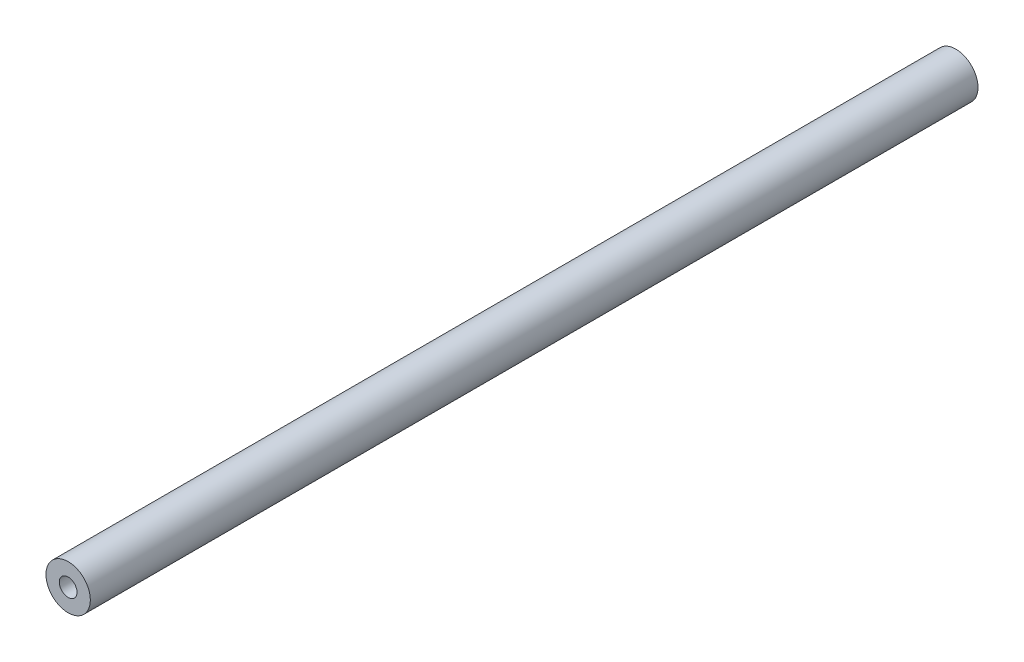
ISO-10303-21;
HEADER;
FILE_DESCRIPTION(('STEP AP214'),'2;1');
FILE_NAME('part.step','',(''),(''),'','','');
FILE_SCHEMA(('AUTOMOTIVE_DESIGN { 1 0 10303 214 1 1 1 1 }'));
ENDSEC;
DATA;
#1=APPLICATION_CONTEXT('core data for automotive mechanical design processes');
#2=APPLICATION_PROTOCOL_DEFINITION('international standard','automotive_design',2000,#1);
#3=PRODUCT_CONTEXT('',#1,'mechanical');
#4=PRODUCT('Part','Part','',(#3));
#5=PRODUCT_RELATED_PRODUCT_CATEGORY('part','',(#4));
#6=PRODUCT_DEFINITION_FORMATION('','',#4);
#7=PRODUCT_DEFINITION_CONTEXT('part definition',#1,'design');
#8=PRODUCT_DEFINITION('design','',#6,#7);
#9=PRODUCT_DEFINITION_SHAPE('','',#8);
#10=(LENGTH_UNIT() NAMED_UNIT(*) SI_UNIT(.MILLI.,.METRE.));
#11=(NAMED_UNIT(*) PLANE_ANGLE_UNIT() SI_UNIT($,.RADIAN.));
#12=(NAMED_UNIT(*) SI_UNIT($,.STERADIAN.) SOLID_ANGLE_UNIT());
#13=UNCERTAINTY_MEASURE_WITH_UNIT(LENGTH_MEASURE(1.E-05),#10,'distance_accuracy_value','');
#14=(GEOMETRIC_REPRESENTATION_CONTEXT(3) GLOBAL_UNCERTAINTY_ASSIGNED_CONTEXT((#13)) GLOBAL_UNIT_ASSIGNED_CONTEXT((#10,
#11,#12)) REPRESENTATION_CONTEXT('',''));
#15=CARTESIAN_POINT('',(0.,0.,0.));
#16=DIRECTION('',(0.,0.,1.));
#17=DIRECTION('',(1.,0.,0.));
#18=AXIS2_PLACEMENT_3D('',#15,#16,#17);
#19=CARTESIAN_POINT('',(0.,0.,300.));
#20=DIRECTION('',(0.,0.,-1.));
#21=DIRECTION('',(-1.,0.,0.));
#22=AXIS2_PLACEMENT_3D('',#19,#20,#21);
#23=CYLINDRICAL_SURFACE('',#22,7.5);
#24=CARTESIAN_POINT('',(0.,0.,300.));
#25=DIRECTION('',(0.,0.,1.));
#26=DIRECTION('',(1.,0.,0.));
#27=AXIS2_PLACEMENT_3D('',#24,#25,#26);
#28=CIRCLE('',#27,7.5);
#29=CARTESIAN_POINT('',(7.5,0.,300.));
#30=VERTEX_POINT('',#29);
#31=EDGE_CURVE('E10',#30,#30,#28,.T.);
#32=ORIENTED_EDGE('',*,*,#31,.F.);
#33=EDGE_LOOP('',(#32));
#34=FACE_BOUND('',#33,.T.);
#35=CARTESIAN_POINT('',(0.,0.,0.));
#36=DIRECTION('',(0.,0.,1.));
#37=DIRECTION('',(1.,0.,0.));
#38=AXIS2_PLACEMENT_3D('',#35,#36,#37);
#39=CIRCLE('',#38,7.5);
#40=CARTESIAN_POINT('',(7.5,0.,0.));
#41=VERTEX_POINT('',#40);
#42=EDGE_CURVE('E35',#41,#41,#39,.T.);
#43=ORIENTED_EDGE('',*,*,#42,.T.);
#44=EDGE_LOOP('',(#43));
#45=FACE_BOUND('',#44,.T.);
#46=ADVANCED_FACE('F32',(#34,#45),#23,.T.);
#47=CARTESIAN_POINT('',(0.,0.,300.));
#48=DIRECTION('',(0.,0.,1.));
#49=DIRECTION('',(1.,0.,0.));
#50=AXIS2_PLACEMENT_3D('',#47,#48,#49);
#51=PLANE('',#50);
#52=CARTESIAN_POINT('',(0.,0.,300.));
#53=DIRECTION('',(0.,0.,1.));
#54=DIRECTION('',(1.,0.,0.));
#55=AXIS2_PLACEMENT_3D('',#52,#53,#54);
#56=CIRCLE('',#55,3.);
#57=CARTESIAN_POINT('',(3.,0.,300.));
#58=VERTEX_POINT('',#57);
#59=EDGE_CURVE('E50',#58,#58,#56,.T.);
#60=ORIENTED_EDGE('',*,*,#59,.F.);
#61=EDGE_LOOP('',(#60));
#62=FACE_BOUND('',#61,.T.);
#63=ORIENTED_EDGE('',*,*,#31,.T.);
#64=EDGE_LOOP('',(#63));
#65=FACE_BOUND('',#64,.T.);
#66=ADVANCED_FACE('F65',(#62,#65),#51,.T.);
#67=CARTESIAN_POINT('',(0.,0.,0.));
#68=DIRECTION('',(0.,0.,1.));
#69=DIRECTION('',(1.,0.,0.));
#70=AXIS2_PLACEMENT_3D('',#67,#68,#69);
#71=PLANE('',#70);
#72=CARTESIAN_POINT('',(0.,0.,0.));
#73=DIRECTION('',(0.,0.,-1.));
#74=DIRECTION('',(-1.,0.,0.));
#75=AXIS2_PLACEMENT_3D('',#72,#73,#74);
#76=CIRCLE('',#75,3.);
#77=CARTESIAN_POINT('',(-3.,0.,0.));
#78=VERTEX_POINT('',#77);
#79=EDGE_CURVE('E44',#78,#78,#76,.T.);
#80=ORIENTED_EDGE('',*,*,#79,.F.);
#81=EDGE_LOOP('',(#80));
#82=FACE_BOUND('',#81,.T.);
#83=ORIENTED_EDGE('',*,*,#42,.F.);
#84=EDGE_LOOP('',(#83));
#85=FACE_BOUND('',#84,.T.);
#86=ADVANCED_FACE('F67',(#82,#85),#71,.F.);
#87=CARTESIAN_POINT('',(0.,0.,30.));
#88=DIRECTION('',(0.,0.,-1.));
#89=DIRECTION('',(-1.,0.,0.));
#90=AXIS2_PLACEMENT_3D('',#87,#88,#89);
#91=CYLINDRICAL_SURFACE('',#90,3.);
#92=CARTESIAN_POINT('',(0.,0.,30.));
#93=DIRECTION('',(0.,0.,-1.));
#94=DIRECTION('',(-1.,0.,0.));
#95=AXIS2_PLACEMENT_3D('',#92,#93,#94);
#96=CIRCLE('',#95,3.);
#97=CARTESIAN_POINT('',(-3.,0.,30.));
#98=VERTEX_POINT('',#97);
#99=EDGE_CURVE('E42',#98,#98,#96,.T.);
#100=ORIENTED_EDGE('',*,*,#99,.F.);
#101=EDGE_LOOP('',(#100));
#102=FACE_BOUND('',#101,.T.);
#103=ORIENTED_EDGE('',*,*,#79,.T.);
#104=EDGE_LOOP('',(#103));
#105=FACE_BOUND('',#104,.T.);
#106=ADVANCED_FACE('F73',(#102,#105),#91,.F.);
#107=CARTESIAN_POINT('',(0.,0.,30.));
#108=DIRECTION('',(0.,0.,-1.));
#109=DIRECTION('',(-1.,0.,0.));
#110=AXIS2_PLACEMENT_3D('',#107,#108,#109);
#111=PLANE('',#110);
#112=ORIENTED_EDGE('',*,*,#99,.T.);
#113=EDGE_LOOP('',(#112));
#114=FACE_BOUND('',#113,.T.);
#115=ADVANCED_FACE('F61',(#114),#111,.T.);
#116=CARTESIAN_POINT('',(0.,0.,270.));
#117=DIRECTION('',(0.,0.,1.));
#118=DIRECTION('',(1.,0.,0.));
#119=AXIS2_PLACEMENT_3D('',#116,#117,#118);
#120=CYLINDRICAL_SURFACE('',#119,3.);
#121=CARTESIAN_POINT('',(0.,0.,270.));
#122=DIRECTION('',(0.,0.,1.));
#123=DIRECTION('',(1.,0.,0.));
#124=AXIS2_PLACEMENT_3D('',#121,#122,#123);
#125=CIRCLE('',#124,3.);
#126=CARTESIAN_POINT('',(3.,0.,270.));
#127=VERTEX_POINT('',#126);
#128=EDGE_CURVE('E47',#127,#127,#125,.T.);
#129=ORIENTED_EDGE('',*,*,#128,.F.);
#130=EDGE_LOOP('',(#129));
#131=FACE_BOUND('',#130,.T.);
#132=ORIENTED_EDGE('',*,*,#59,.T.);
#133=EDGE_LOOP('',(#132));
#134=FACE_BOUND('',#133,.T.);
#135=ADVANCED_FACE('F58',(#131,#134),#120,.F.);
#136=CARTESIAN_POINT('',(0.,0.,270.));
#137=DIRECTION('',(0.,0.,1.));
#138=DIRECTION('',(1.,0.,0.));
#139=AXIS2_PLACEMENT_3D('',#136,#137,#138);
#140=PLANE('',#139);
#141=ORIENTED_EDGE('',*,*,#128,.T.);
#142=EDGE_LOOP('',(#141));
#143=FACE_BOUND('',#142,.T.);
#144=ADVANCED_FACE('F56',(#143),#140,.T.);
#145=CLOSED_SHELL('',(#46,#66,#86,#106,#115,#135,#144));
#146=MANIFOLD_SOLID_BREP('B2',#145);
#147=ADVANCED_BREP_SHAPE_REPRESENTATION('',(#18,#146),#14);
#148=SHAPE_DEFINITION_REPRESENTATION(#9,#147);
ENDSEC;
END-ISO-10303-21;
